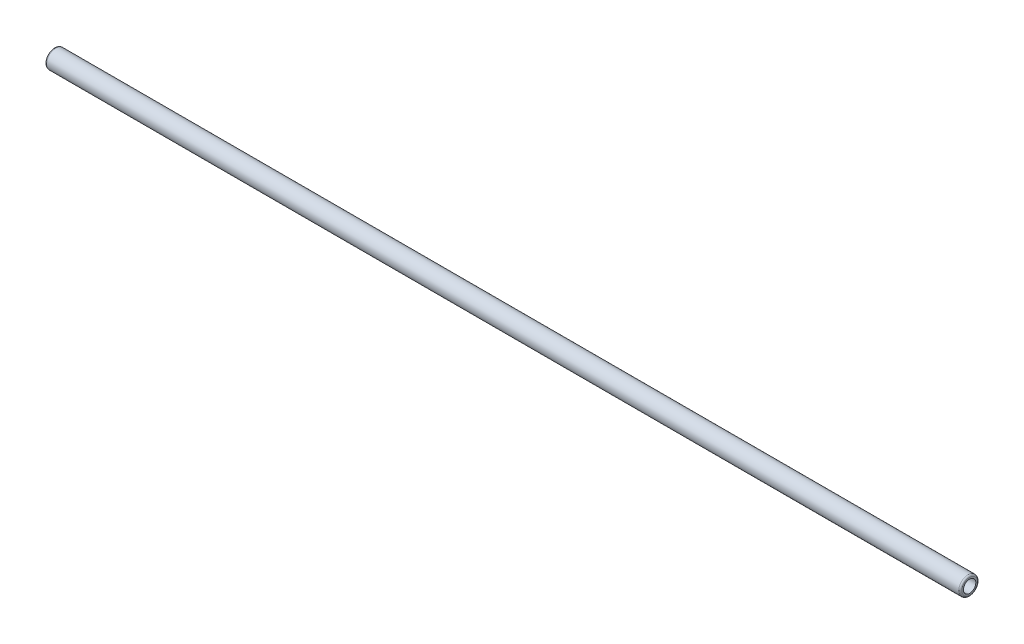
ISO-10303-21;
HEADER;
FILE_DESCRIPTION(('STEP AP214'),'2;1');
FILE_NAME('part.step','',(''),(''),'','','');
FILE_SCHEMA(('AUTOMOTIVE_DESIGN { 1 0 10303 214 1 1 1 1 }'));
ENDSEC;
DATA;
#1=APPLICATION_CONTEXT('core data for automotive mechanical design processes');
#2=APPLICATION_PROTOCOL_DEFINITION('international standard','automotive_design',2000,#1);
#3=PRODUCT_CONTEXT('',#1,'mechanical');
#4=PRODUCT('Part','Part','',(#3));
#5=PRODUCT_RELATED_PRODUCT_CATEGORY('part','',(#4));
#6=PRODUCT_DEFINITION_FORMATION('','',#4);
#7=PRODUCT_DEFINITION_CONTEXT('part definition',#1,'design');
#8=PRODUCT_DEFINITION('design','',#6,#7);
#9=PRODUCT_DEFINITION_SHAPE('','',#8);
#10=(LENGTH_UNIT() NAMED_UNIT(*) SI_UNIT(.MILLI.,.METRE.));
#11=(NAMED_UNIT(*) PLANE_ANGLE_UNIT() SI_UNIT($,.RADIAN.));
#12=(NAMED_UNIT(*) SI_UNIT($,.STERADIAN.) SOLID_ANGLE_UNIT());
#13=UNCERTAINTY_MEASURE_WITH_UNIT(LENGTH_MEASURE(1.E-05),#10,'distance_accuracy_value','');
#14=(GEOMETRIC_REPRESENTATION_CONTEXT(3) GLOBAL_UNCERTAINTY_ASSIGNED_CONTEXT((#13)) GLOBAL_UNIT_ASSIGNED_CONTEXT((#10,
#11,#12)) REPRESENTATION_CONTEXT('',''));
#15=CARTESIAN_POINT('',(0.,0.,0.));
#16=DIRECTION('',(0.,0.,1.));
#17=DIRECTION('',(1.,0.,0.));
#18=AXIS2_PLACEMENT_3D('',#15,#16,#17);
#19=CARTESIAN_POINT('',(148.,0.,0.));
#20=DIRECTION('',(1.,0.,0.));
#21=DIRECTION('',(0.,0.,-1.));
#22=AXIS2_PLACEMENT_3D('',#19,#20,#21);
#23=PLANE('',#22);
#24=CARTESIAN_POINT('',(148.,0.,0.));
#25=DIRECTION('',(1.,0.,0.));
#26=DIRECTION('',(0.,0.,-1.));
#27=AXIS2_PLACEMENT_3D('',#24,#25,#26);
#28=CIRCLE('',#27,2.5);
#29=CARTESIAN_POINT('',(148.,0.,-2.5));
#30=VERTEX_POINT('',#29);
#31=EDGE_CURVE('E10',#30,#30,#28,.T.);
#32=ORIENTED_EDGE('',*,*,#31,.T.);
#33=EDGE_LOOP('',(#32));
#34=FACE_BOUND('',#33,.T.);
#35=CARTESIAN_POINT('',(148.,0.,0.));
#36=DIRECTION('',(1.,0.,0.));
#37=DIRECTION('',(0.,0.,-1.));
#38=AXIS2_PLACEMENT_3D('',#35,#36,#37);
#39=CIRCLE('',#38,2.);
#40=CARTESIAN_POINT('',(148.,0.,-2.));
#41=VERTEX_POINT('',#40);
#42=EDGE_CURVE('E53',#41,#41,#39,.T.);
#43=ORIENTED_EDGE('',*,*,#42,.F.);
#44=EDGE_LOOP('',(#43));
#45=FACE_BOUND('',#44,.T.);
#46=ADVANCED_FACE('F33',(#34,#45),#23,.T.);
#47=CARTESIAN_POINT('',(-148.,0.,0.));
#48=DIRECTION('',(1.,0.,0.));
#49=DIRECTION('',(0.,0.,-1.));
#50=AXIS2_PLACEMENT_3D('',#47,#48,#49);
#51=PLANE('',#50);
#52=CARTESIAN_POINT('',(-148.,0.,0.));
#53=DIRECTION('',(1.,0.,0.));
#54=DIRECTION('',(0.,0.,-1.));
#55=AXIS2_PLACEMENT_3D('',#52,#53,#54);
#56=CIRCLE('',#55,2.5);
#57=CARTESIAN_POINT('',(-148.,0.,-2.5));
#58=VERTEX_POINT('',#57);
#59=EDGE_CURVE('E40',#58,#58,#56,.F.);
#60=ORIENTED_EDGE('',*,*,#59,.T.);
#61=EDGE_LOOP('',(#60));
#62=FACE_BOUND('',#61,.T.);
#63=CARTESIAN_POINT('',(-148.,0.,0.));
#64=DIRECTION('',(1.,0.,0.));
#65=DIRECTION('',(0.,0.,-1.));
#66=AXIS2_PLACEMENT_3D('',#63,#64,#65);
#67=CIRCLE('',#66,2.);
#68=CARTESIAN_POINT('',(-148.,0.,-2.));
#69=VERTEX_POINT('',#68);
#70=EDGE_CURVE('E54',#69,#69,#67,.T.);
#71=ORIENTED_EDGE('',*,*,#70,.T.);
#72=EDGE_LOOP('',(#71));
#73=FACE_BOUND('',#72,.T.);
#74=ADVANCED_FACE('F64',(#62,#73),#51,.F.);
#75=CARTESIAN_POINT('',(148.,0.,0.));
#76=DIRECTION('',(-1.,0.,0.));
#77=DIRECTION('',(0.,0.,1.));
#78=AXIS2_PLACEMENT_3D('',#75,#76,#77);
#79=CYLINDRICAL_SURFACE('',#78,3.);
#80=CARTESIAN_POINT('',(-147.5,0.,0.));
#81=DIRECTION('',(1.,0.,0.));
#82=DIRECTION('',(0.,0.,-1.));
#83=AXIS2_PLACEMENT_3D('',#80,#81,#82);
#84=CIRCLE('',#83,3.);
#85=CARTESIAN_POINT('',(-147.5,0.,-3.));
#86=VERTEX_POINT('',#85);
#87=EDGE_CURVE('E44',#86,#86,#84,.T.);
#88=ORIENTED_EDGE('',*,*,#87,.T.);
#89=EDGE_LOOP('',(#88));
#90=FACE_BOUND('',#89,.T.);
#91=CARTESIAN_POINT('',(147.5,0.,0.));
#92=DIRECTION('',(1.,0.,0.));
#93=DIRECTION('',(0.,0.,-1.));
#94=AXIS2_PLACEMENT_3D('',#91,#92,#93);
#95=CIRCLE('',#94,3.);
#96=CARTESIAN_POINT('',(147.5,0.,-3.));
#97=VERTEX_POINT('',#96);
#98=EDGE_CURVE('E48',#97,#97,#95,.F.);
#99=ORIENTED_EDGE('',*,*,#98,.T.);
#100=EDGE_LOOP('',(#99));
#101=FACE_BOUND('',#100,.T.);
#102=ADVANCED_FACE('F69',(#90,#101),#79,.T.);
#103=CARTESIAN_POINT('',(148.,0.,0.));
#104=DIRECTION('',(-1.,0.,0.));
#105=DIRECTION('',(0.,0.,1.));
#106=AXIS2_PLACEMENT_3D('',#103,#104,#105);
#107=CYLINDRICAL_SURFACE('',#106,2.);
#108=ORIENTED_EDGE('',*,*,#42,.T.);
#109=EDGE_LOOP('',(#108));
#110=FACE_BOUND('',#109,.T.);
#111=ORIENTED_EDGE('',*,*,#70,.F.);
#112=EDGE_LOOP('',(#111));
#113=FACE_BOUND('',#112,.T.);
#114=ADVANCED_FACE('F60',(#110,#113),#107,.F.);
#115=CARTESIAN_POINT('',(-147.5,0.,0.));
#116=DIRECTION('',(1.,0.,0.));
#117=DIRECTION('',(0.,0.,-1.));
#118=AXIS2_PLACEMENT_3D('',#115,#116,#117);
#119=TOROIDAL_SURFACE('',#118,2.5,0.5);
#120=ORIENTED_EDGE('',*,*,#59,.F.);
#121=EDGE_LOOP('',(#120));
#122=FACE_BOUND('',#121,.T.);
#123=ORIENTED_EDGE('',*,*,#87,.F.);
#124=EDGE_LOOP('',(#123));
#125=FACE_BOUND('',#124,.T.);
#126=ADVANCED_FACE('F75',(#122,#125),#119,.T.);
#127=CARTESIAN_POINT('',(147.5,0.,0.));
#128=DIRECTION('',(1.,0.,0.));
#129=DIRECTION('',(0.,0.,-1.));
#130=AXIS2_PLACEMENT_3D('',#127,#128,#129);
#131=TOROIDAL_SURFACE('',#130,2.5,0.5);
#132=ORIENTED_EDGE('',*,*,#98,.F.);
#133=EDGE_LOOP('',(#132));
#134=FACE_BOUND('',#133,.T.);
#135=ORIENTED_EDGE('',*,*,#31,.F.);
#136=EDGE_LOOP('',(#135));
#137=FACE_BOUND('',#136,.T.);
#138=ADVANCED_FACE('F35',(#134,#137),#131,.T.);
#139=CLOSED_SHELL('',(#46,#74,#102,#114,#126,#138));
#140=MANIFOLD_SOLID_BREP('B2',#139);
#141=ADVANCED_BREP_SHAPE_REPRESENTATION('',(#18,#140),#14);
#142=SHAPE_DEFINITION_REPRESENTATION(#9,#141);
ENDSEC;
END-ISO-10303-21;
